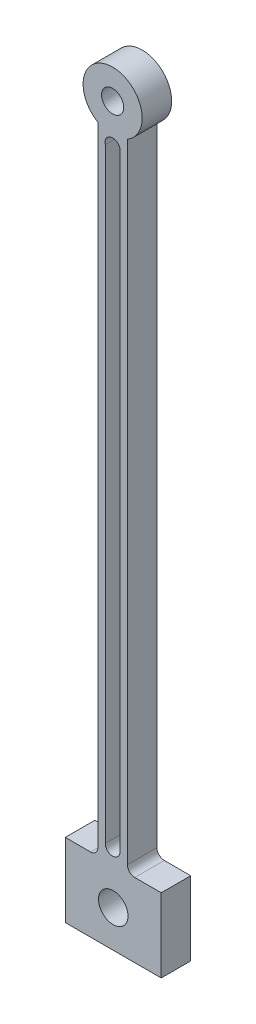
ISO-10303-21;
HEADER;
FILE_DESCRIPTION(('STEP AP214'),'2;1');
FILE_NAME('part.step','',(''),(''),'','','');
FILE_SCHEMA(('AUTOMOTIVE_DESIGN { 1 0 10303 214 1 1 1 1 }'));
ENDSEC;
DATA;
#1=APPLICATION_CONTEXT('core data for automotive mechanical design processes');
#2=APPLICATION_PROTOCOL_DEFINITION('international standard','automotive_design',2000,#1);
#3=PRODUCT_CONTEXT('',#1,'mechanical');
#4=PRODUCT('Part','Part','',(#3));
#5=PRODUCT_RELATED_PRODUCT_CATEGORY('part','',(#4));
#6=PRODUCT_DEFINITION_FORMATION('','',#4);
#7=PRODUCT_DEFINITION_CONTEXT('part definition',#1,'design');
#8=PRODUCT_DEFINITION('design','',#6,#7);
#9=PRODUCT_DEFINITION_SHAPE('','',#8);
#10=(LENGTH_UNIT() NAMED_UNIT(*) SI_UNIT(.MILLI.,.METRE.));
#11=(NAMED_UNIT(*) PLANE_ANGLE_UNIT() SI_UNIT($,.RADIAN.));
#12=(NAMED_UNIT(*) SI_UNIT($,.STERADIAN.) SOLID_ANGLE_UNIT());
#13=UNCERTAINTY_MEASURE_WITH_UNIT(LENGTH_MEASURE(1.E-05),#10,'distance_accuracy_value','');
#14=(GEOMETRIC_REPRESENTATION_CONTEXT(3) GLOBAL_UNCERTAINTY_ASSIGNED_CONTEXT((#13)) GLOBAL_UNIT_ASSIGNED_CONTEXT((#10,
#11,#12)) REPRESENTATION_CONTEXT('',''));
#15=CARTESIAN_POINT('',(0.,0.,0.));
#16=DIRECTION('',(0.,0.,1.));
#17=DIRECTION('',(1.,0.,0.));
#18=AXIS2_PLACEMENT_3D('',#15,#16,#17);
#19=CARTESIAN_POINT('',(0.,-179.163249220386,8.));
#20=DIRECTION('',(0.,-1.,0.));
#21=DIRECTION('',(0.,0.,-1.));
#22=AXIS2_PLACEMENT_3D('',#19,#20,#21);
#23=PLANE('',#22);
#24=DIRECTION('',(-1.,0.,0.));
#25=VECTOR('',#24,1.);
#26=CARTESIAN_POINT('',(0.,-179.163249220386,0.));
#27=LINE('',#26,#25);
#28=CARTESIAN_POINT('',(13.1630062299759,-179.163249220386,0.));
#29=VERTEX_POINT('',#28);
#30=CARTESIAN_POINT('',(5.99999999999998,-179.163249220386,0.));
#31=VERTEX_POINT('',#30);
#32=EDGE_CURVE('E198',#29,#31,#27,.T.);
#33=ORIENTED_EDGE('',*,*,#32,.T.);
#34=DIRECTION('',(0.,0.,-1.));
#35=VECTOR('',#34,1.);
#36=CARTESIAN_POINT('',(5.99999999999998,-179.163249220386,8.));
#37=LINE('',#36,#35);
#38=CARTESIAN_POINT('',(5.99999999999998,-179.163249220386,8.));
#39=VERTEX_POINT('',#38);
#40=EDGE_CURVE('E11',#39,#31,#37,.T.);
#41=ORIENTED_EDGE('',*,*,#40,.F.);
#42=DIRECTION('',(-1.,0.,0.));
#43=VECTOR('',#42,1.);
#44=CARTESIAN_POINT('',(0.,-179.163249220386,8.));
#45=LINE('',#44,#43);
#46=CARTESIAN_POINT('',(13.1630062299759,-179.163249220386,8.));
#47=VERTEX_POINT('',#46);
#48=EDGE_CURVE('E267',#47,#39,#45,.T.);
#49=ORIENTED_EDGE('',*,*,#48,.F.);
#50=DIRECTION('',(0.,0.,-1.));
#51=VECTOR('',#50,1.);
#52=CARTESIAN_POINT('',(13.1630062299759,-179.163249220386,8.));
#53=LINE('',#52,#51);
#54=EDGE_CURVE('E59',#47,#29,#53,.T.);
#55=ORIENTED_EDGE('',*,*,#54,.T.);
#56=EDGE_LOOP('',(#33,#41,#49,#55));
#57=FACE_BOUND('',#56,.T.);
#58=ADVANCED_FACE('F40',(#57),#23,.F.);
#59=CARTESIAN_POINT('',(5.99999999999998,-177.163249220386,8.));
#60=DIRECTION('',(0.,0.,-1.));
#61=DIRECTION('',(-1.,0.,0.));
#62=AXIS2_PLACEMENT_3D('',#59,#60,#61);
#63=CYLINDRICAL_SURFACE('',#62,2.);
#64=CARTESIAN_POINT('',(5.99999999999998,-177.163249220386,0.));
#65=DIRECTION('',(0.,0.,1.));
#66=DIRECTION('',(1.,0.,0.));
#67=AXIS2_PLACEMENT_3D('',#64,#65,#66);
#68=CIRCLE('',#67,2.);
#69=CARTESIAN_POINT('',(3.99999999999998,-177.163249220386,0.));
#70=VERTEX_POINT('',#69);
#71=EDGE_CURVE('E200',#31,#70,#68,.F.);
#72=ORIENTED_EDGE('',*,*,#71,.T.);
#73=DIRECTION('',(0.,0.,-1.));
#74=VECTOR('',#73,1.);
#75=CARTESIAN_POINT('',(3.99999999999998,-177.163249220386,8.));
#76=LINE('',#75,#74);
#77=CARTESIAN_POINT('',(3.99999999999998,-177.163249220386,8.));
#78=VERTEX_POINT('',#77);
#79=EDGE_CURVE('E50',#78,#70,#76,.T.);
#80=ORIENTED_EDGE('',*,*,#79,.F.);
#81=CARTESIAN_POINT('',(5.99999999999998,-177.163249220386,8.));
#82=DIRECTION('',(0.,0.,1.));
#83=DIRECTION('',(1.,0.,0.));
#84=AXIS2_PLACEMENT_3D('',#81,#82,#83);
#85=CIRCLE('',#84,2.);
#86=EDGE_CURVE('E274',#39,#78,#85,.F.);
#87=ORIENTED_EDGE('',*,*,#86,.F.);
#88=ORIENTED_EDGE('',*,*,#40,.T.);
#89=EDGE_LOOP('',(#72,#80,#87,#88));
#90=FACE_BOUND('',#89,.T.);
#91=ADVANCED_FACE('F310',(#90),#63,.F.);
#92=CARTESIAN_POINT('',(4.,0.,8.));
#93=DIRECTION('',(1.,0.,0.));
#94=DIRECTION('',(0.,1.,0.));
#95=AXIS2_PLACEMENT_3D('',#92,#93,#94);
#96=PLANE('',#95);
#97=DIRECTION('',(0.,-1.,0.));
#98=VECTOR('',#97,1.);
#99=CARTESIAN_POINT('',(4.,0.,0.));
#100=LINE('',#99,#98);
#101=CARTESIAN_POINT('',(4.,-6.92820323027551,0.));
#102=VERTEX_POINT('',#101);
#103=EDGE_CURVE('E203',#102,#70,#100,.T.);
#104=ORIENTED_EDGE('',*,*,#103,.F.);
#105=DIRECTION('',(0.,0.,-1.));
#106=VECTOR('',#105,1.);
#107=CARTESIAN_POINT('',(4.,-6.92820323027551,8.));
#108=LINE('',#107,#106);
#109=CARTESIAN_POINT('',(4.,-6.92820323027551,8.));
#110=VERTEX_POINT('',#109);
#111=EDGE_CURVE('E239',#110,#102,#108,.T.);
#112=ORIENTED_EDGE('',*,*,#111,.F.);
#113=DIRECTION('',(0.,-1.,0.));
#114=VECTOR('',#113,1.);
#115=CARTESIAN_POINT('',(4.,0.,8.));
#116=LINE('',#115,#114);
#117=EDGE_CURVE('E276',#110,#78,#116,.T.);
#118=ORIENTED_EDGE('',*,*,#117,.T.);
#119=ORIENTED_EDGE('',*,*,#79,.T.);
#120=EDGE_LOOP('',(#104,#112,#118,#119));
#121=FACE_BOUND('',#120,.T.);
#122=ADVANCED_FACE('F315',(#121),#96,.T.);
#123=CARTESIAN_POINT('',(0.,0.,8.));
#124=DIRECTION('',(0.,0.,-1.));
#125=DIRECTION('',(-1.,0.,0.));
#126=AXIS2_PLACEMENT_3D('',#123,#124,#125);
#127=CYLINDRICAL_SURFACE('',#126,8.);
#128=CARTESIAN_POINT('',(0.,0.,0.));
#129=DIRECTION('',(0.,0.,1.));
#130=DIRECTION('',(1.,0.,0.));
#131=AXIS2_PLACEMENT_3D('',#128,#129,#130);
#132=CIRCLE('',#131,8.);
#133=CARTESIAN_POINT('',(-4.,-6.92820323027551,0.));
#134=VERTEX_POINT('',#133);
#135=EDGE_CURVE('E206',#102,#134,#132,.T.);
#136=ORIENTED_EDGE('',*,*,#135,.T.);
#137=DIRECTION('',(0.,0.,-1.));
#138=VECTOR('',#137,1.);
#139=CARTESIAN_POINT('',(-4.,-6.92820323027551,8.));
#140=LINE('',#139,#138);
#141=CARTESIAN_POINT('',(-4.,-6.92820323027551,8.));
#142=VERTEX_POINT('',#141);
#143=EDGE_CURVE('E236',#142,#134,#140,.T.);
#144=ORIENTED_EDGE('',*,*,#143,.F.);
#145=CARTESIAN_POINT('',(0.,0.,8.));
#146=DIRECTION('',(0.,0.,1.));
#147=DIRECTION('',(1.,0.,0.));
#148=AXIS2_PLACEMENT_3D('',#145,#146,#147);
#149=CIRCLE('',#148,8.);
#150=EDGE_CURVE('E279',#110,#142,#149,.T.);
#151=ORIENTED_EDGE('',*,*,#150,.F.);
#152=ORIENTED_EDGE('',*,*,#111,.T.);
#153=EDGE_LOOP('',(#136,#144,#151,#152));
#154=FACE_BOUND('',#153,.T.);
#155=ADVANCED_FACE('F457',(#154),#127,.T.);
#156=CARTESIAN_POINT('',(-4.,0.,8.));
#157=DIRECTION('',(1.,0.,0.));
#158=DIRECTION('',(0.,1.,0.));
#159=AXIS2_PLACEMENT_3D('',#156,#157,#158);
#160=PLANE('',#159);
#161=DIRECTION('',(0.,-1.,0.));
#162=VECTOR('',#161,1.);
#163=CARTESIAN_POINT('',(-4.,0.,0.));
#164=LINE('',#163,#162);
#165=CARTESIAN_POINT('',(-3.99999999999998,-177.163249220386,0.));
#166=VERTEX_POINT('',#165);
#167=EDGE_CURVE('E208',#134,#166,#164,.T.);
#168=ORIENTED_EDGE('',*,*,#167,.T.);
#169=DIRECTION('',(0.,0.,-1.));
#170=VECTOR('',#169,1.);
#171=CARTESIAN_POINT('',(-3.99999999999998,-177.163249220386,8.));
#172=LINE('',#171,#170);
#173=CARTESIAN_POINT('',(-3.99999999999998,-177.163249220386,8.));
#174=VERTEX_POINT('',#173);
#175=EDGE_CURVE('E234',#174,#166,#172,.T.);
#176=ORIENTED_EDGE('',*,*,#175,.F.);
#177=DIRECTION('',(0.,-1.,0.));
#178=VECTOR('',#177,1.);
#179=CARTESIAN_POINT('',(-4.,0.,8.));
#180=LINE('',#179,#178);
#181=EDGE_CURVE('E281',#142,#174,#180,.T.);
#182=ORIENTED_EDGE('',*,*,#181,.F.);
#183=ORIENTED_EDGE('',*,*,#143,.T.);
#184=EDGE_LOOP('',(#168,#176,#182,#183));
#185=FACE_BOUND('',#184,.T.);
#186=ADVANCED_FACE('F294',(#185),#160,.F.);
#187=CARTESIAN_POINT('',(-5.99999999999998,-177.163249220386,8.));
#188=DIRECTION('',(0.,0.,-1.));
#189=DIRECTION('',(-1.,0.,0.));
#190=AXIS2_PLACEMENT_3D('',#187,#188,#189);
#191=CYLINDRICAL_SURFACE('',#190,2.);
#192=CARTESIAN_POINT('',(-5.99999999999998,-177.163249220386,0.));
#193=DIRECTION('',(0.,0.,1.));
#194=DIRECTION('',(1.,0.,0.));
#195=AXIS2_PLACEMENT_3D('',#192,#193,#194);
#196=CIRCLE('',#195,2.);
#197=CARTESIAN_POINT('',(-5.99999999999998,-179.163249220386,0.));
#198=VERTEX_POINT('',#197);
#199=EDGE_CURVE('E211',#198,#166,#196,.T.);
#200=ORIENTED_EDGE('',*,*,#199,.F.);
#201=DIRECTION('',(0.,0.,-1.));
#202=VECTOR('',#201,1.);
#203=CARTESIAN_POINT('',(-5.99999999999998,-179.163249220386,8.));
#204=LINE('',#203,#202);
#205=CARTESIAN_POINT('',(-5.99999999999998,-179.163249220386,8.));
#206=VERTEX_POINT('',#205);
#207=EDGE_CURVE('E232',#206,#198,#204,.T.);
#208=ORIENTED_EDGE('',*,*,#207,.F.);
#209=CARTESIAN_POINT('',(-5.99999999999998,-177.163249220386,8.));
#210=DIRECTION('',(0.,0.,1.));
#211=DIRECTION('',(1.,0.,0.));
#212=AXIS2_PLACEMENT_3D('',#209,#210,#211);
#213=CIRCLE('',#212,2.);
#214=EDGE_CURVE('E283',#206,#174,#213,.T.);
#215=ORIENTED_EDGE('',*,*,#214,.T.);
#216=ORIENTED_EDGE('',*,*,#175,.T.);
#217=EDGE_LOOP('',(#200,#208,#215,#216));
#218=FACE_BOUND('',#217,.T.);
#219=ADVANCED_FACE('F287',(#218),#191,.F.);
#220=CARTESIAN_POINT('',(0.,-179.163249220386,8.));
#221=DIRECTION('',(0.,-1.,0.));
#222=DIRECTION('',(0.,0.,-1.));
#223=AXIS2_PLACEMENT_3D('',#220,#221,#222);
#224=PLANE('',#223);
#225=DIRECTION('',(-1.,0.,0.));
#226=VECTOR('',#225,1.);
#227=CARTESIAN_POINT('',(0.,-179.163249220386,0.));
#228=LINE('',#227,#226);
#229=CARTESIAN_POINT('',(-12.8369937700241,-179.163249220386,0.));
#230=VERTEX_POINT('',#229);
#231=EDGE_CURVE('E214',#198,#230,#228,.T.);
#232=ORIENTED_EDGE('',*,*,#231,.T.);
#233=DIRECTION('',(0.,0.,-1.));
#234=VECTOR('',#233,1.);
#235=CARTESIAN_POINT('',(-12.8369937700241,-179.163249220386,8.));
#236=LINE('',#235,#234);
#237=CARTESIAN_POINT('',(-12.8369937700241,-179.163249220386,8.));
#238=VERTEX_POINT('',#237);
#239=EDGE_CURVE('E171',#238,#230,#236,.T.);
#240=ORIENTED_EDGE('',*,*,#239,.F.);
#241=DIRECTION('',(-1.,0.,0.));
#242=VECTOR('',#241,1.);
#243=CARTESIAN_POINT('',(0.,-179.163249220386,8.));
#244=LINE('',#243,#242);
#245=EDGE_CURVE('E159',#206,#238,#244,.T.);
#246=ORIENTED_EDGE('',*,*,#245,.F.);
#247=ORIENTED_EDGE('',*,*,#207,.T.);
#248=EDGE_LOOP('',(#232,#240,#246,#247));
#249=FACE_BOUND('',#248,.T.);
#250=ADVANCED_FACE('F300',(#249),#224,.F.);
#251=CARTESIAN_POINT('',(-12.8369937700242,0.,8.));
#252=DIRECTION('',(1.,0.,0.));
#253=DIRECTION('',(0.,1.,0.));
#254=AXIS2_PLACEMENT_3D('',#251,#252,#253);
#255=PLANE('',#254);
#256=DIRECTION('',(0.,-1.,0.));
#257=VECTOR('',#256,1.);
#258=CARTESIAN_POINT('',(-12.8369937700242,0.,0.));
#259=LINE('',#258,#257);
#260=CARTESIAN_POINT('',(-12.8369937700241,-199.163249220386,0.));
#261=VERTEX_POINT('',#260);
#262=EDGE_CURVE('E168',#230,#261,#259,.T.);
#263=ORIENTED_EDGE('',*,*,#262,.T.);
#264=DIRECTION('',(0.,0.,-1.));
#265=VECTOR('',#264,1.);
#266=CARTESIAN_POINT('',(-12.8369937700241,-199.163249220386,8.));
#267=LINE('',#266,#265);
#268=CARTESIAN_POINT('',(-12.8369937700241,-199.163249220386,8.));
#269=VERTEX_POINT('',#268);
#270=EDGE_CURVE('E165',#269,#261,#267,.T.);
#271=ORIENTED_EDGE('',*,*,#270,.F.);
#272=DIRECTION('',(0.,-1.,0.));
#273=VECTOR('',#272,1.);
#274=CARTESIAN_POINT('',(-12.8369937700242,0.,8.));
#275=LINE('',#274,#273);
#276=EDGE_CURVE('E149',#238,#269,#275,.T.);
#277=ORIENTED_EDGE('',*,*,#276,.F.);
#278=ORIENTED_EDGE('',*,*,#239,.T.);
#279=EDGE_LOOP('',(#263,#271,#277,#278));
#280=FACE_BOUND('',#279,.T.);
#281=ADVANCED_FACE('F166',(#280),#255,.F.);
#282=CARTESIAN_POINT('',(0.,-199.163249220386,8.));
#283=DIRECTION('',(0.,-1.,0.));
#284=DIRECTION('',(0.,0.,-1.));
#285=AXIS2_PLACEMENT_3D('',#282,#283,#284);
#286=PLANE('',#285);
#287=DIRECTION('',(-1.,0.,0.));
#288=VECTOR('',#287,1.);
#289=CARTESIAN_POINT('',(0.,-199.163249220386,0.));
#290=LINE('',#289,#288);
#291=CARTESIAN_POINT('',(13.1630062299759,-199.163249220386,0.));
#292=VERTEX_POINT('',#291);
#293=EDGE_CURVE('E217',#292,#261,#290,.T.);
#294=ORIENTED_EDGE('',*,*,#293,.F.);
#295=DIRECTION('',(0.,0.,-1.));
#296=VECTOR('',#295,1.);
#297=CARTESIAN_POINT('',(13.1630062299759,-199.163249220386,8.));
#298=LINE('',#297,#296);
#299=CARTESIAN_POINT('',(13.1630062299759,-199.163249220386,8.));
#300=VERTEX_POINT('',#299);
#301=EDGE_CURVE('E103',#300,#292,#298,.T.);
#302=ORIENTED_EDGE('',*,*,#301,.F.);
#303=DIRECTION('',(-1.,0.,0.));
#304=VECTOR('',#303,1.);
#305=CARTESIAN_POINT('',(0.,-199.163249220386,8.));
#306=LINE('',#305,#304);
#307=EDGE_CURVE('E156',#300,#269,#306,.T.);
#308=ORIENTED_EDGE('',*,*,#307,.T.);
#309=ORIENTED_EDGE('',*,*,#270,.T.);
#310=EDGE_LOOP('',(#294,#302,#308,#309));
#311=FACE_BOUND('',#310,.T.);
#312=ADVANCED_FACE('F173',(#311),#286,.T.);
#313=CARTESIAN_POINT('',(0.,-175.163249220386,8.));
#314=DIRECTION('',(0.,0.,-1.));
#315=DIRECTION('',(-1.,0.,0.));
#316=AXIS2_PLACEMENT_3D('',#313,#314,#315);
#317=CYLINDRICAL_SURFACE('',#316,2.);
#318=CARTESIAN_POINT('',(0.,-175.163249220386,0.));
#319=DIRECTION('',(0.,0.,1.));
#320=DIRECTION('',(1.,0.,0.));
#321=AXIS2_PLACEMENT_3D('',#318,#319,#320);
#322=CIRCLE('',#321,2.);
#323=CARTESIAN_POINT('',(-1.99999999999998,-175.163249220386,0.));
#324=VERTEX_POINT('',#323);
#325=CARTESIAN_POINT('',(2.00000000000002,-175.163249220386,0.));
#326=VERTEX_POINT('',#325);
#327=EDGE_CURVE('E186',#324,#326,#322,.T.);
#328=ORIENTED_EDGE('',*,*,#327,.F.);
#329=DIRECTION('',(0.,0.,-1.));
#330=VECTOR('',#329,1.);
#331=CARTESIAN_POINT('',(-1.99999999999998,-175.163249220386,8.));
#332=LINE('',#331,#330);
#333=CARTESIAN_POINT('',(-1.99999999999998,-175.163249220386,8.));
#334=VERTEX_POINT('',#333);
#335=EDGE_CURVE('E44',#334,#324,#332,.T.);
#336=ORIENTED_EDGE('',*,*,#335,.F.);
#337=CARTESIAN_POINT('',(0.,-175.163249220386,8.));
#338=DIRECTION('',(0.,0.,1.));
#339=DIRECTION('',(1.,0.,0.));
#340=AXIS2_PLACEMENT_3D('',#337,#338,#339);
#341=CIRCLE('',#340,2.);
#342=CARTESIAN_POINT('',(2.00000000000002,-175.163249220386,8.));
#343=VERTEX_POINT('',#342);
#344=EDGE_CURVE('E228',#334,#343,#341,.T.);
#345=ORIENTED_EDGE('',*,*,#344,.T.);
#346=DIRECTION('',(0.,0.,-1.));
#347=VECTOR('',#346,1.);
#348=CARTESIAN_POINT('',(2.00000000000002,-175.163249220386,8.));
#349=LINE('',#348,#347);
#350=EDGE_CURVE('E185',#343,#326,#349,.T.);
#351=ORIENTED_EDGE('',*,*,#350,.T.);
#352=EDGE_LOOP('',(#328,#336,#345,#351));
#353=FACE_BOUND('',#352,.T.);
#354=ADVANCED_FACE('F42',(#353),#317,.F.);
#355=CARTESIAN_POINT('',(-2.,0.,8.));
#356=DIRECTION('',(1.,0.,0.));
#357=DIRECTION('',(0.,1.,0.));
#358=AXIS2_PLACEMENT_3D('',#355,#356,#357);
#359=PLANE('',#358);
#360=DIRECTION('',(0.,-1.,0.));
#361=VECTOR('',#360,1.);
#362=CARTESIAN_POINT('',(-2.,0.,0.));
#363=LINE('',#362,#361);
#364=CARTESIAN_POINT('',(-2.,-11.1768710489065,0.));
#365=VERTEX_POINT('',#364);
#366=EDGE_CURVE('E189',#365,#324,#363,.T.);
#367=ORIENTED_EDGE('',*,*,#366,.F.);
#368=DIRECTION('',(0.,0.,-1.));
#369=VECTOR('',#368,1.);
#370=CARTESIAN_POINT('',(-2.,-11.1768710489065,8.));
#371=LINE('',#370,#369);
#372=CARTESIAN_POINT('',(-2.,-11.1768710489065,8.));
#373=VERTEX_POINT('',#372);
#374=EDGE_CURVE('E244',#373,#365,#371,.T.);
#375=ORIENTED_EDGE('',*,*,#374,.F.);
#376=DIRECTION('',(0.,-1.,0.));
#377=VECTOR('',#376,1.);
#378=CARTESIAN_POINT('',(-2.,0.,8.));
#379=LINE('',#378,#377);
#380=EDGE_CURVE('E253',#373,#334,#379,.T.);
#381=ORIENTED_EDGE('',*,*,#380,.T.);
#382=ORIENTED_EDGE('',*,*,#335,.T.);
#383=EDGE_LOOP('',(#367,#375,#381,#382));
#384=FACE_BOUND('',#383,.T.);
#385=ADVANCED_FACE('F251',(#384),#359,.T.);
#386=CARTESIAN_POINT('',(0.,-10.6821216252276,8.));
#387=DIRECTION('',(0.,0.,-1.));
#388=DIRECTION('',(-1.,0.,0.));
#389=AXIS2_PLACEMENT_3D('',#386,#387,#388);
#390=CYLINDRICAL_SURFACE('',#389,2.06028565791996);
#391=CARTESIAN_POINT('',(0.,-10.6821216252276,0.));
#392=DIRECTION('',(0.,0.,1.));
#393=DIRECTION('',(1.,0.,0.));
#394=AXIS2_PLACEMENT_3D('',#391,#392,#393);
#395=CIRCLE('',#394,2.06028565791996);
#396=CARTESIAN_POINT('',(2.,-11.1768710489065,0.));
#397=VERTEX_POINT('',#396);
#398=EDGE_CURVE('E192',#397,#365,#395,.T.);
#399=ORIENTED_EDGE('',*,*,#398,.F.);
#400=DIRECTION('',(0.,0.,-1.));
#401=VECTOR('',#400,1.);
#402=CARTESIAN_POINT('',(2.,-11.1768710489065,8.));
#403=LINE('',#402,#401);
#404=CARTESIAN_POINT('',(2.,-11.1768710489065,8.));
#405=VERTEX_POINT('',#404);
#406=EDGE_CURVE('E243',#405,#397,#403,.T.);
#407=ORIENTED_EDGE('',*,*,#406,.F.);
#408=CARTESIAN_POINT('',(0.,-10.6821216252276,8.));
#409=DIRECTION('',(0.,0.,1.));
#410=DIRECTION('',(1.,0.,0.));
#411=AXIS2_PLACEMENT_3D('',#408,#409,#410);
#412=CIRCLE('',#411,2.06028565791996);
#413=EDGE_CURVE('E262',#405,#373,#412,.T.);
#414=ORIENTED_EDGE('',*,*,#413,.T.);
#415=ORIENTED_EDGE('',*,*,#374,.T.);
#416=EDGE_LOOP('',(#399,#407,#414,#415));
#417=FACE_BOUND('',#416,.T.);
#418=ADVANCED_FACE('F259',(#417),#390,.F.);
#419=CARTESIAN_POINT('',(0.163006229975863,-189.163249220386,8.));
#420=DIRECTION('',(0.,0.,-1.));
#421=DIRECTION('',(-1.,0.,0.));
#422=AXIS2_PLACEMENT_3D('',#419,#420,#421);
#423=CYLINDRICAL_SURFACE('',#422,4.);
#424=CARTESIAN_POINT('',(0.163006229975863,-189.163249220386,8.));
#425=DIRECTION('',(0.,0.,1.));
#426=DIRECTION('',(1.,0.,0.));
#427=AXIS2_PLACEMENT_3D('',#424,#425,#426);
#428=CIRCLE('',#427,4.);
#429=CARTESIAN_POINT('',(4.16300622997587,-189.163249220386,8.));
#430=VERTEX_POINT('',#429);
#431=EDGE_CURVE('E176',#430,#430,#428,.T.);
#432=ORIENTED_EDGE('',*,*,#431,.T.);
#433=EDGE_LOOP('',(#432));
#434=FACE_BOUND('',#433,.T.);
#435=CARTESIAN_POINT('',(0.163006229975863,-189.163249220386,0.));
#436=DIRECTION('',(0.,0.,1.));
#437=DIRECTION('',(1.,0.,0.));
#438=AXIS2_PLACEMENT_3D('',#435,#436,#437);
#439=CIRCLE('',#438,4.);
#440=CARTESIAN_POINT('',(4.16300622997587,-189.163249220386,0.));
#441=VERTEX_POINT('',#440);
#442=EDGE_CURVE('E222',#441,#441,#439,.T.);
#443=ORIENTED_EDGE('',*,*,#442,.F.);
#444=EDGE_LOOP('',(#443));
#445=FACE_BOUND('',#444,.T.);
#446=ADVANCED_FACE('F325',(#434,#445),#423,.F.);
#447=CARTESIAN_POINT('',(13.1630062299758,0.,8.));
#448=DIRECTION('',(1.,0.,0.));
#449=DIRECTION('',(0.,1.,0.));
#450=AXIS2_PLACEMENT_3D('',#447,#448,#449);
#451=PLANE('',#450);
#452=DIRECTION('',(0.,-1.,0.));
#453=VECTOR('',#452,1.);
#454=CARTESIAN_POINT('',(13.1630062299758,0.,0.));
#455=LINE('',#454,#453);
#456=EDGE_CURVE('E219',#29,#292,#455,.T.);
#457=ORIENTED_EDGE('',*,*,#456,.F.);
#458=ORIENTED_EDGE('',*,*,#54,.F.);
#459=DIRECTION('',(0.,-1.,0.));
#460=VECTOR('',#459,1.);
#461=CARTESIAN_POINT('',(13.1630062299758,0.,8.));
#462=LINE('',#461,#460);
#463=EDGE_CURVE('E174',#47,#300,#462,.T.);
#464=ORIENTED_EDGE('',*,*,#463,.T.);
#465=ORIENTED_EDGE('',*,*,#301,.T.);
#466=EDGE_LOOP('',(#457,#458,#464,#465));
#467=FACE_BOUND('',#466,.T.);
#468=ADVANCED_FACE('F323',(#467),#451,.T.);
#469=CARTESIAN_POINT('',(2.,0.,8.));
#470=DIRECTION('',(1.,0.,0.));
#471=DIRECTION('',(0.,1.,0.));
#472=AXIS2_PLACEMENT_3D('',#469,#470,#471);
#473=PLANE('',#472);
#474=DIRECTION('',(0.,-1.,0.));
#475=VECTOR('',#474,1.);
#476=CARTESIAN_POINT('',(2.,0.,0.));
#477=LINE('',#476,#475);
#478=EDGE_CURVE('E195',#397,#326,#477,.T.);
#479=ORIENTED_EDGE('',*,*,#478,.T.);
#480=ORIENTED_EDGE('',*,*,#350,.F.);
#481=DIRECTION('',(0.,-1.,0.));
#482=VECTOR('',#481,1.);
#483=CARTESIAN_POINT('',(2.,0.,8.));
#484=LINE('',#483,#482);
#485=EDGE_CURVE('E264',#405,#343,#484,.T.);
#486=ORIENTED_EDGE('',*,*,#485,.F.);
#487=ORIENTED_EDGE('',*,*,#406,.T.);
#488=EDGE_LOOP('',(#479,#480,#486,#487));
#489=FACE_BOUND('',#488,.T.);
#490=ADVANCED_FACE('F265',(#489),#473,.F.);
#491=CARTESIAN_POINT('',(0.,0.,8.));
#492=DIRECTION('',(0.,0.,-1.));
#493=DIRECTION('',(-1.,0.,0.));
#494=AXIS2_PLACEMENT_3D('',#491,#492,#493);
#495=CYLINDRICAL_SURFACE('',#494,3.);
#496=CARTESIAN_POINT('',(0.,0.,8.));
#497=DIRECTION('',(0.,0.,1.));
#498=DIRECTION('',(1.,0.,0.));
#499=AXIS2_PLACEMENT_3D('',#496,#497,#498);
#500=CIRCLE('',#499,3.);
#501=CARTESIAN_POINT('',(3.,0.,8.));
#502=VERTEX_POINT('',#501);
#503=EDGE_CURVE('E182',#502,#502,#500,.T.);
#504=ORIENTED_EDGE('',*,*,#503,.T.);
#505=EDGE_LOOP('',(#504));
#506=FACE_BOUND('',#505,.T.);
#507=CARTESIAN_POINT('',(0.,0.,0.));
#508=DIRECTION('',(0.,0.,1.));
#509=DIRECTION('',(1.,0.,0.));
#510=AXIS2_PLACEMENT_3D('',#507,#508,#509);
#511=CIRCLE('',#510,3.);
#512=CARTESIAN_POINT('',(3.,0.,0.));
#513=VERTEX_POINT('',#512);
#514=EDGE_CURVE('E225',#513,#513,#511,.T.);
#515=ORIENTED_EDGE('',*,*,#514,.F.);
#516=EDGE_LOOP('',(#515));
#517=FACE_BOUND('',#516,.T.);
#518=ADVANCED_FACE('F322',(#506,#517),#495,.F.);
#519=CARTESIAN_POINT('',(0.,0.,8.));
#520=DIRECTION('',(0.,0.,1.));
#521=DIRECTION('',(1.,0.,0.));
#522=AXIS2_PLACEMENT_3D('',#519,#520,#521);
#523=PLANE('',#522);
#524=ORIENTED_EDGE('',*,*,#344,.F.);
#525=ORIENTED_EDGE('',*,*,#380,.F.);
#526=ORIENTED_EDGE('',*,*,#413,.F.);
#527=ORIENTED_EDGE('',*,*,#485,.T.);
#528=EDGE_LOOP('',(#524,#525,#526,#527));
#529=FACE_BOUND('',#528,.T.);
#530=ORIENTED_EDGE('',*,*,#48,.T.);
#531=ORIENTED_EDGE('',*,*,#86,.T.);
#532=ORIENTED_EDGE('',*,*,#117,.F.);
#533=ORIENTED_EDGE('',*,*,#150,.T.);
#534=ORIENTED_EDGE('',*,*,#181,.T.);
#535=ORIENTED_EDGE('',*,*,#214,.F.);
#536=ORIENTED_EDGE('',*,*,#245,.T.);
#537=ORIENTED_EDGE('',*,*,#276,.T.);
#538=ORIENTED_EDGE('',*,*,#307,.F.);
#539=ORIENTED_EDGE('',*,*,#463,.F.);
#540=EDGE_LOOP('',(#530,#531,#532,#533,#534,#535,#536,#537,#538,#539));
#541=FACE_BOUND('',#540,.T.);
#542=ORIENTED_EDGE('',*,*,#431,.F.);
#543=EDGE_LOOP('',(#542));
#544=FACE_BOUND('',#543,.T.);
#545=ORIENTED_EDGE('',*,*,#503,.F.);
#546=EDGE_LOOP('',(#545));
#547=FACE_BOUND('',#546,.T.);
#548=ADVANCED_FACE('F152',(#529,#541,#544,#547),#523,.T.);
#549=CARTESIAN_POINT('',(0.,0.,0.));
#550=DIRECTION('',(0.,0.,1.));
#551=DIRECTION('',(1.,0.,0.));
#552=AXIS2_PLACEMENT_3D('',#549,#550,#551);
#553=PLANE('',#552);
#554=ORIENTED_EDGE('',*,*,#327,.T.);
#555=ORIENTED_EDGE('',*,*,#478,.F.);
#556=ORIENTED_EDGE('',*,*,#398,.T.);
#557=ORIENTED_EDGE('',*,*,#366,.T.);
#558=EDGE_LOOP('',(#554,#555,#556,#557));
#559=FACE_BOUND('',#558,.T.);
#560=ORIENTED_EDGE('',*,*,#32,.F.);
#561=ORIENTED_EDGE('',*,*,#456,.T.);
#562=ORIENTED_EDGE('',*,*,#293,.T.);
#563=ORIENTED_EDGE('',*,*,#262,.F.);
#564=ORIENTED_EDGE('',*,*,#231,.F.);
#565=ORIENTED_EDGE('',*,*,#199,.T.);
#566=ORIENTED_EDGE('',*,*,#167,.F.);
#567=ORIENTED_EDGE('',*,*,#135,.F.);
#568=ORIENTED_EDGE('',*,*,#103,.T.);
#569=ORIENTED_EDGE('',*,*,#71,.F.);
#570=EDGE_LOOP('',(#560,#561,#562,#563,#564,#565,#566,#567,#568,#569));
#571=FACE_BOUND('',#570,.T.);
#572=ORIENTED_EDGE('',*,*,#442,.T.);
#573=EDGE_LOOP('',(#572));
#574=FACE_BOUND('',#573,.T.);
#575=ORIENTED_EDGE('',*,*,#514,.T.);
#576=EDGE_LOOP('',(#575));
#577=FACE_BOUND('',#576,.T.);
#578=ADVANCED_FACE('F257',(#559,#571,#574,#577),#553,.F.);
#579=CLOSED_SHELL('',(#58,#91,#122,#155,#186,#219,#250,#281,#312,#354,#385,#418,#446,#468,#490,
#518,#548,#578));
#580=MANIFOLD_SOLID_BREP('B2',#579);
#581=ADVANCED_BREP_SHAPE_REPRESENTATION('',(#18,#580),#14);
#582=SHAPE_DEFINITION_REPRESENTATION(#9,#581);
ENDSEC;
END-ISO-10303-21;
